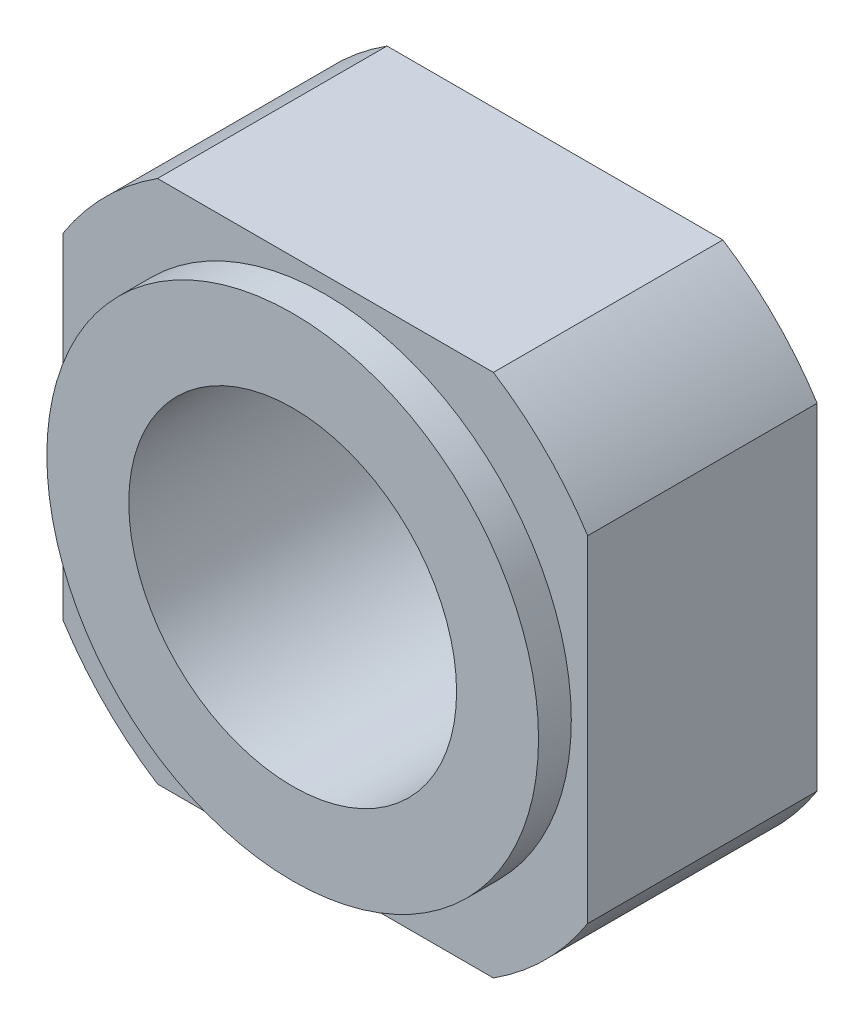
ISO-10303-21;
HEADER;
FILE_DESCRIPTION(('STEP AP214'),'2;1');
FILE_NAME('part.step','',(''),(''),'','','');
FILE_SCHEMA(('AUTOMOTIVE_DESIGN { 1 0 10303 214 1 1 1 1 }'));
ENDSEC;
DATA;
#1=APPLICATION_CONTEXT('core data for automotive mechanical design processes');
#2=APPLICATION_PROTOCOL_DEFINITION('international standard','automotive_design',2000,#1);
#3=PRODUCT_CONTEXT('',#1,'mechanical');
#4=PRODUCT('Part','Part','',(#3));
#5=PRODUCT_RELATED_PRODUCT_CATEGORY('part','',(#4));
#6=PRODUCT_DEFINITION_FORMATION('','',#4);
#7=PRODUCT_DEFINITION_CONTEXT('part definition',#1,'design');
#8=PRODUCT_DEFINITION('design','',#6,#7);
#9=PRODUCT_DEFINITION_SHAPE('','',#8);
#10=(LENGTH_UNIT() NAMED_UNIT(*) SI_UNIT(.MILLI.,.METRE.));
#11=(NAMED_UNIT(*) PLANE_ANGLE_UNIT() SI_UNIT($,.RADIAN.));
#12=(NAMED_UNIT(*) SI_UNIT($,.STERADIAN.) SOLID_ANGLE_UNIT());
#13=UNCERTAINTY_MEASURE_WITH_UNIT(LENGTH_MEASURE(1.E-05),#10,'distance_accuracy_value','');
#14=(GEOMETRIC_REPRESENTATION_CONTEXT(3) GLOBAL_UNCERTAINTY_ASSIGNED_CONTEXT((#13)) GLOBAL_UNIT_ASSIGNED_CONTEXT((#10,
#11,#12)) REPRESENTATION_CONTEXT('',''));
#15=CARTESIAN_POINT('',(0.,0.,0.));
#16=DIRECTION('',(0.,0.,1.));
#17=DIRECTION('',(1.,0.,0.));
#18=AXIS2_PLACEMENT_3D('',#15,#16,#17);
#19=CARTESIAN_POINT('',(0.,0.,8.));
#20=DIRECTION('',(0.,0.,1.));
#21=DIRECTION('',(1.,0.,0.));
#22=AXIS2_PLACEMENT_3D('',#19,#20,#21);
#23=PLANE('',#22);
#24=CARTESIAN_POINT('',(0.,0.,8.));
#25=DIRECTION('',(0.,0.,1.));
#26=DIRECTION('',(1.,0.,0.));
#27=AXIS2_PLACEMENT_3D('',#24,#25,#26);
#28=CIRCLE('',#27,5.);
#29=CARTESIAN_POINT('',(5.,0.,8.));
#30=VERTEX_POINT('',#29);
#31=EDGE_CURVE('E141',#30,#30,#28,.T.);
#32=ORIENTED_EDGE('',*,*,#31,.F.);
#33=EDGE_LOOP('',(#32));
#34=FACE_BOUND('',#33,.T.);
#35=CARTESIAN_POINT('',(0.,0.,8.));
#36=DIRECTION('',(0.,0.,1.));
#37=DIRECTION('',(1.,0.,0.));
#38=AXIS2_PLACEMENT_3D('',#35,#36,#37);
#39=CIRCLE('',#38,7.5);
#40=CARTESIAN_POINT('',(7.5,0.,8.));
#41=VERTEX_POINT('',#40);
#42=EDGE_CURVE('E165',#41,#41,#39,.T.);
#43=ORIENTED_EDGE('',*,*,#42,.T.);
#44=EDGE_LOOP('',(#43));
#45=FACE_BOUND('',#44,.T.);
#46=ADVANCED_FACE('F35',(#34,#45),#23,.T.);
#47=CARTESIAN_POINT('',(0.,0.,8.));
#48=DIRECTION('',(0.,0.,-1.));
#49=DIRECTION('',(-1.,0.,0.));
#50=AXIS2_PLACEMENT_3D('',#47,#48,#49);
#51=CYLINDRICAL_SURFACE('',#50,9.5);
#52=CARTESIAN_POINT('',(0.,0.,7.));
#53=DIRECTION('',(0.,0.,1.));
#54=DIRECTION('',(1.,0.,0.));
#55=AXIS2_PLACEMENT_3D('',#52,#53,#54);
#56=CIRCLE('',#55,9.5);
#57=CARTESIAN_POINT('',(-5.1234753829798,8.,7.));
#58=VERTEX_POINT('',#57);
#59=CARTESIAN_POINT('',(-8.,5.12347538297979,7.));
#60=VERTEX_POINT('',#59);
#61=EDGE_CURVE('E50',#58,#60,#56,.T.);
#62=ORIENTED_EDGE('',*,*,#61,.F.);
#63=DIRECTION('',(0.,0.,-1.));
#64=VECTOR('',#63,1.);
#65=CARTESIAN_POINT('',(-5.1234753829798,8.,8.));
#66=LINE('',#65,#64);
#67=CARTESIAN_POINT('',(-5.1234753829798,8.,0.));
#68=VERTEX_POINT('',#67);
#69=EDGE_CURVE('E130',#68,#58,#66,.F.);
#70=ORIENTED_EDGE('',*,*,#69,.F.);
#71=CARTESIAN_POINT('',(0.,0.,0.));
#72=DIRECTION('',(0.,0.,1.));
#73=DIRECTION('',(1.,0.,0.));
#74=AXIS2_PLACEMENT_3D('',#71,#72,#73);
#75=CIRCLE('',#74,9.5);
#76=CARTESIAN_POINT('',(-8.,5.12347538297979,0.));
#77=VERTEX_POINT('',#76);
#78=EDGE_CURVE('E136',#68,#77,#75,.T.);
#79=ORIENTED_EDGE('',*,*,#78,.T.);
#80=DIRECTION('',(0.,0.,-1.));
#81=VECTOR('',#80,1.);
#82=CARTESIAN_POINT('',(-8.,5.12347538297979,8.));
#83=LINE('',#82,#81);
#84=EDGE_CURVE('E43',#60,#77,#83,.T.);
#85=ORIENTED_EDGE('',*,*,#84,.F.);
#86=EDGE_LOOP('',(#62,#70,#79,#85));
#87=FACE_BOUND('',#86,.T.);
#88=ADVANCED_FACE('F37',(#87),#51,.T.);
#89=CARTESIAN_POINT('',(0.,0.,7.));
#90=DIRECTION('',(0.,0.,1.));
#91=DIRECTION('',(1.,0.,0.));
#92=AXIS2_PLACEMENT_3D('',#89,#90,#91);
#93=CIRCLE('',#92,9.5);
#94=CARTESIAN_POINT('',(-8.,-5.12347538297979,7.));
#95=VERTEX_POINT('',#94);
#96=CARTESIAN_POINT('',(-5.1234753829798,-8.,7.));
#97=VERTEX_POINT('',#96);
#98=EDGE_CURVE('E100',#95,#97,#93,.T.);
#99=ORIENTED_EDGE('',*,*,#98,.F.);
#100=DIRECTION('',(0.,0.,-1.));
#101=VECTOR('',#100,1.);
#102=CARTESIAN_POINT('',(-8.,-5.12347538297979,8.));
#103=LINE('',#102,#101);
#104=CARTESIAN_POINT('',(-8.,-5.12347538297979,0.));
#105=VERTEX_POINT('',#104);
#106=EDGE_CURVE('E110',#105,#95,#103,.F.);
#107=ORIENTED_EDGE('',*,*,#106,.F.);
#108=CARTESIAN_POINT('',(-5.1234753829798,-8.,0.));
#109=VERTEX_POINT('',#108);
#110=EDGE_CURVE('E206',#105,#109,#75,.T.);
#111=ORIENTED_EDGE('',*,*,#110,.T.);
#112=DIRECTION('',(0.,0.,-1.));
#113=VECTOR('',#112,1.);
#114=CARTESIAN_POINT('',(-5.1234753829798,-8.,8.));
#115=LINE('',#114,#113);
#116=EDGE_CURVE('E112',#97,#109,#115,.T.);
#117=ORIENTED_EDGE('',*,*,#116,.F.);
#118=EDGE_LOOP('',(#99,#107,#111,#117));
#119=FACE_BOUND('',#118,.T.);
#120=ADVANCED_FACE('F108',(#119),#51,.T.);
#121=CARTESIAN_POINT('',(0.,0.,7.));
#122=DIRECTION('',(0.,0.,1.));
#123=DIRECTION('',(1.,0.,0.));
#124=AXIS2_PLACEMENT_3D('',#121,#122,#123);
#125=CIRCLE('',#124,9.5);
#126=CARTESIAN_POINT('',(5.12347538297979,-8.,7.));
#127=VERTEX_POINT('',#126);
#128=CARTESIAN_POINT('',(8.,-5.1234753829798,7.));
#129=VERTEX_POINT('',#128);
#130=EDGE_CURVE('E155',#127,#129,#125,.T.);
#131=ORIENTED_EDGE('',*,*,#130,.F.);
#132=DIRECTION('',(0.,0.,-1.));
#133=VECTOR('',#132,1.);
#134=CARTESIAN_POINT('',(5.1234753829798,-8.,8.));
#135=LINE('',#134,#133);
#136=CARTESIAN_POINT('',(5.1234753829798,-8.,0.));
#137=VERTEX_POINT('',#136);
#138=EDGE_CURVE('E119',#137,#127,#135,.F.);
#139=ORIENTED_EDGE('',*,*,#138,.F.);
#140=CARTESIAN_POINT('',(8.,-5.1234753829798,0.));
#141=VERTEX_POINT('',#140);
#142=EDGE_CURVE('E137',#137,#141,#75,.T.);
#143=ORIENTED_EDGE('',*,*,#142,.T.);
#144=DIRECTION('',(0.,0.,-1.));
#145=VECTOR('',#144,1.);
#146=CARTESIAN_POINT('',(8.,-5.1234753829798,8.));
#147=LINE('',#146,#145);
#148=EDGE_CURVE('E123',#129,#141,#147,.T.);
#149=ORIENTED_EDGE('',*,*,#148,.F.);
#150=EDGE_LOOP('',(#131,#139,#143,#149));
#151=FACE_BOUND('',#150,.T.);
#152=ADVANCED_FACE('F213',(#151),#51,.T.);
#153=CARTESIAN_POINT('',(0.,0.,7.));
#154=DIRECTION('',(0.,0.,1.));
#155=DIRECTION('',(1.,0.,0.));
#156=AXIS2_PLACEMENT_3D('',#153,#154,#155);
#157=CIRCLE('',#156,9.5);
#158=CARTESIAN_POINT('',(8.,5.1234753829798,7.));
#159=VERTEX_POINT('',#158);
#160=CARTESIAN_POINT('',(5.12347538297979,8.,7.));
#161=VERTEX_POINT('',#160);
#162=EDGE_CURVE('E157',#159,#161,#157,.T.);
#163=ORIENTED_EDGE('',*,*,#162,.F.);
#164=DIRECTION('',(0.,0.,-1.));
#165=VECTOR('',#164,1.);
#166=CARTESIAN_POINT('',(8.,5.1234753829798,8.));
#167=LINE('',#166,#165);
#168=CARTESIAN_POINT('',(8.,5.1234753829798,0.));
#169=VERTEX_POINT('',#168);
#170=EDGE_CURVE('E125',#169,#159,#167,.F.);
#171=ORIENTED_EDGE('',*,*,#170,.F.);
#172=CARTESIAN_POINT('',(5.1234753829798,8.,0.));
#173=VERTEX_POINT('',#172);
#174=EDGE_CURVE('E133',#169,#173,#75,.T.);
#175=ORIENTED_EDGE('',*,*,#174,.T.);
#176=DIRECTION('',(0.,0.,-1.));
#177=VECTOR('',#176,1.);
#178=CARTESIAN_POINT('',(5.1234753829798,8.,8.));
#179=LINE('',#178,#177);
#180=EDGE_CURVE('E128',#161,#173,#179,.T.);
#181=ORIENTED_EDGE('',*,*,#180,.F.);
#182=EDGE_LOOP('',(#163,#171,#175,#181));
#183=FACE_BOUND('',#182,.T.);
#184=ADVANCED_FACE('F192',(#183),#51,.T.);
#185=CARTESIAN_POINT('',(8.,8.,28.));
#186=DIRECTION('',(0.,1.,0.));
#187=DIRECTION('',(0.,0.,1.));
#188=AXIS2_PLACEMENT_3D('',#185,#186,#187);
#189=PLANE('',#188);
#190=ORIENTED_EDGE('',*,*,#69,.T.);
#191=DIRECTION('',(1.,0.,0.));
#192=VECTOR('',#191,1.);
#193=CARTESIAN_POINT('',(8.,8.,7.));
#194=LINE('',#193,#192);
#195=EDGE_CURVE('E159',#58,#161,#194,.T.);
#196=ORIENTED_EDGE('',*,*,#195,.T.);
#197=ORIENTED_EDGE('',*,*,#180,.T.);
#198=DIRECTION('',(1.,0.,0.));
#199=VECTOR('',#198,1.);
#200=CARTESIAN_POINT('',(8.,8.,0.));
#201=LINE('',#200,#199);
#202=EDGE_CURVE('E148',#68,#173,#201,.T.);
#203=ORIENTED_EDGE('',*,*,#202,.F.);
#204=EDGE_LOOP('',(#190,#196,#197,#203));
#205=FACE_BOUND('',#204,.T.);
#206=ADVANCED_FACE('F222',(#205),#189,.T.);
#207=CARTESIAN_POINT('',(8.,-8.,28.));
#208=DIRECTION('',(1.,0.,0.));
#209=DIRECTION('',(0.,0.,-1.));
#210=AXIS2_PLACEMENT_3D('',#207,#208,#209);
#211=PLANE('',#210);
#212=ORIENTED_EDGE('',*,*,#170,.T.);
#213=DIRECTION('',(0.,-1.,0.));
#214=VECTOR('',#213,1.);
#215=CARTESIAN_POINT('',(8.,-8.,7.));
#216=LINE('',#215,#214);
#217=EDGE_CURVE('E152',#159,#129,#216,.T.);
#218=ORIENTED_EDGE('',*,*,#217,.T.);
#219=ORIENTED_EDGE('',*,*,#148,.T.);
#220=DIRECTION('',(0.,-1.,0.));
#221=VECTOR('',#220,1.);
#222=CARTESIAN_POINT('',(8.,-8.,0.));
#223=LINE('',#222,#221);
#224=EDGE_CURVE('E145',#169,#141,#223,.T.);
#225=ORIENTED_EDGE('',*,*,#224,.F.);
#226=EDGE_LOOP('',(#212,#218,#219,#225));
#227=FACE_BOUND('',#226,.T.);
#228=ADVANCED_FACE('F217',(#227),#211,.T.);
#229=CARTESIAN_POINT('',(8.,-8.,28.));
#230=DIRECTION('',(0.,-1.,0.));
#231=DIRECTION('',(0.,0.,-1.));
#232=AXIS2_PLACEMENT_3D('',#229,#230,#231);
#233=PLANE('',#232);
#234=ORIENTED_EDGE('',*,*,#138,.T.);
#235=DIRECTION('',(-1.,0.,0.));
#236=VECTOR('',#235,1.);
#237=CARTESIAN_POINT('',(8.,-8.,7.));
#238=LINE('',#237,#236);
#239=EDGE_CURVE('E162',#127,#97,#238,.T.);
#240=ORIENTED_EDGE('',*,*,#239,.T.);
#241=ORIENTED_EDGE('',*,*,#116,.T.);
#242=DIRECTION('',(-1.,0.,0.));
#243=VECTOR('',#242,1.);
#244=CARTESIAN_POINT('',(8.,-8.,0.));
#245=LINE('',#244,#243);
#246=EDGE_CURVE('E57',#137,#109,#245,.T.);
#247=ORIENTED_EDGE('',*,*,#246,.F.);
#248=EDGE_LOOP('',(#234,#240,#241,#247));
#249=FACE_BOUND('',#248,.T.);
#250=ADVANCED_FACE('F201',(#249),#233,.T.);
#251=CARTESIAN_POINT('',(-8.,-8.,28.));
#252=DIRECTION('',(-1.,0.,0.));
#253=DIRECTION('',(0.,0.,1.));
#254=AXIS2_PLACEMENT_3D('',#251,#252,#253);
#255=PLANE('',#254);
#256=ORIENTED_EDGE('',*,*,#106,.T.);
#257=DIRECTION('',(0.,1.,0.));
#258=VECTOR('',#257,1.);
#259=CARTESIAN_POINT('',(-8.,-8.,7.));
#260=LINE('',#259,#258);
#261=EDGE_CURVE('E12',#95,#60,#260,.T.);
#262=ORIENTED_EDGE('',*,*,#261,.T.);
#263=ORIENTED_EDGE('',*,*,#84,.T.);
#264=DIRECTION('',(0.,1.,0.));
#265=VECTOR('',#264,1.);
#266=CARTESIAN_POINT('',(-8.,-8.,0.));
#267=LINE('',#266,#265);
#268=EDGE_CURVE('E117',#105,#77,#267,.T.);
#269=ORIENTED_EDGE('',*,*,#268,.F.);
#270=EDGE_LOOP('',(#256,#262,#263,#269));
#271=FACE_BOUND('',#270,.T.);
#272=ADVANCED_FACE('F115',(#271),#255,.T.);
#273=CARTESIAN_POINT('',(0.,0.,0.));
#274=DIRECTION('',(0.,0.,1.));
#275=DIRECTION('',(1.,0.,0.));
#276=AXIS2_PLACEMENT_3D('',#273,#274,#275);
#277=PLANE('',#276);
#278=CARTESIAN_POINT('',(0.,0.,0.));
#279=DIRECTION('',(0.,0.,1.));
#280=DIRECTION('',(1.,0.,0.));
#281=AXIS2_PLACEMENT_3D('',#278,#279,#280);
#282=CIRCLE('',#281,5.);
#283=CARTESIAN_POINT('',(5.,0.,0.));
#284=VERTEX_POINT('',#283);
#285=EDGE_CURVE('E138',#284,#284,#282,.T.);
#286=ORIENTED_EDGE('',*,*,#285,.T.);
#287=EDGE_LOOP('',(#286));
#288=FACE_BOUND('',#287,.T.);
#289=ORIENTED_EDGE('',*,*,#268,.T.);
#290=ORIENTED_EDGE('',*,*,#78,.F.);
#291=ORIENTED_EDGE('',*,*,#202,.T.);
#292=ORIENTED_EDGE('',*,*,#174,.F.);
#293=ORIENTED_EDGE('',*,*,#224,.T.);
#294=ORIENTED_EDGE('',*,*,#142,.F.);
#295=ORIENTED_EDGE('',*,*,#246,.T.);
#296=ORIENTED_EDGE('',*,*,#110,.F.);
#297=EDGE_LOOP('',(#289,#290,#291,#292,#293,#294,#295,#296));
#298=FACE_BOUND('',#297,.T.);
#299=ADVANCED_FACE('F181',(#288,#298),#277,.F.);
#300=CARTESIAN_POINT('',(0.,0.,8.));
#301=DIRECTION('',(0.,0.,-1.));
#302=DIRECTION('',(-1.,0.,0.));
#303=AXIS2_PLACEMENT_3D('',#300,#301,#302);
#304=CYLINDRICAL_SURFACE('',#303,5.);
#305=ORIENTED_EDGE('',*,*,#31,.T.);
#306=EDGE_LOOP('',(#305));
#307=FACE_BOUND('',#306,.T.);
#308=ORIENTED_EDGE('',*,*,#285,.F.);
#309=EDGE_LOOP('',(#308));
#310=FACE_BOUND('',#309,.T.);
#311=ADVANCED_FACE('F174',(#307,#310),#304,.F.);
#312=CARTESIAN_POINT('',(0.,0.,7.));
#313=DIRECTION('',(0.,0.,1.));
#314=DIRECTION('',(1.,0.,0.));
#315=AXIS2_PLACEMENT_3D('',#312,#313,#314);
#316=PLANE('',#315);
#317=ORIENTED_EDGE('',*,*,#162,.T.);
#318=ORIENTED_EDGE('',*,*,#195,.F.);
#319=ORIENTED_EDGE('',*,*,#61,.T.);
#320=ORIENTED_EDGE('',*,*,#261,.F.);
#321=ORIENTED_EDGE('',*,*,#98,.T.);
#322=ORIENTED_EDGE('',*,*,#239,.F.);
#323=ORIENTED_EDGE('',*,*,#130,.T.);
#324=ORIENTED_EDGE('',*,*,#217,.F.);
#325=EDGE_LOOP('',(#317,#318,#319,#320,#321,#322,#323,#324));
#326=FACE_BOUND('',#325,.T.);
#327=CARTESIAN_POINT('',(0.,0.,7.));
#328=DIRECTION('',(0.,0.,1.));
#329=DIRECTION('',(1.,0.,0.));
#330=AXIS2_PLACEMENT_3D('',#327,#328,#329);
#331=CIRCLE('',#330,7.5);
#332=CARTESIAN_POINT('',(7.5,0.,7.));
#333=VERTEX_POINT('',#332);
#334=EDGE_CURVE('E113',#333,#333,#331,.T.);
#335=ORIENTED_EDGE('',*,*,#334,.F.);
#336=EDGE_LOOP('',(#335));
#337=FACE_BOUND('',#336,.T.);
#338=ADVANCED_FACE('F98',(#326,#337),#316,.T.);
#339=CARTESIAN_POINT('',(0.,0.,7.));
#340=DIRECTION('',(0.,0.,1.));
#341=DIRECTION('',(1.,0.,0.));
#342=AXIS2_PLACEMENT_3D('',#339,#340,#341);
#343=CYLINDRICAL_SURFACE('',#342,7.5);
#344=ORIENTED_EDGE('',*,*,#334,.T.);
#345=EDGE_LOOP('',(#344));
#346=FACE_BOUND('',#345,.T.);
#347=ORIENTED_EDGE('',*,*,#42,.F.);
#348=EDGE_LOOP('',(#347));
#349=FACE_BOUND('',#348,.T.);
#350=ADVANCED_FACE('F171',(#346,#349),#343,.T.);
#351=CLOSED_SHELL('',(#46,#88,#120,#152,#184,#206,#228,#250,#272,#299,#311,#338,#350));
#352=MANIFOLD_SOLID_BREP('B2',#351);
#353=ADVANCED_BREP_SHAPE_REPRESENTATION('',(#18,#352),#14);
#354=SHAPE_DEFINITION_REPRESENTATION(#9,#353);
ENDSEC;
END-ISO-10303-21;
